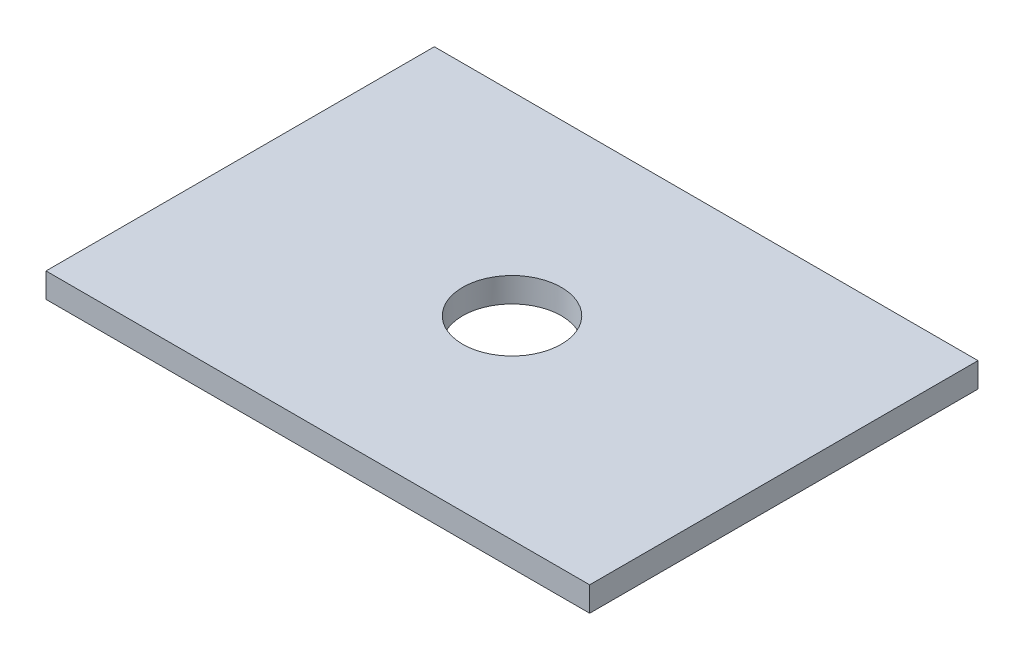
ISO-10303-21;
HEADER;
FILE_DESCRIPTION(('STEP AP214'),'2;1');
FILE_NAME('part.step','',(''),(''),'','','');
FILE_SCHEMA(('AUTOMOTIVE_DESIGN { 1 0 10303 214 1 1 1 1 }'));
ENDSEC;
DATA;
#1=APPLICATION_CONTEXT('core data for automotive mechanical design processes');
#2=APPLICATION_PROTOCOL_DEFINITION('international standard','automotive_design',2000,#1);
#3=PRODUCT_CONTEXT('',#1,'mechanical');
#4=PRODUCT('Part','Part','',(#3));
#5=PRODUCT_RELATED_PRODUCT_CATEGORY('part','',(#4));
#6=PRODUCT_DEFINITION_FORMATION('','',#4);
#7=PRODUCT_DEFINITION_CONTEXT('part definition',#1,'design');
#8=PRODUCT_DEFINITION('design','',#6,#7);
#9=PRODUCT_DEFINITION_SHAPE('','',#8);
#10=(LENGTH_UNIT() NAMED_UNIT(*) SI_UNIT(.MILLI.,.METRE.));
#11=(NAMED_UNIT(*) PLANE_ANGLE_UNIT() SI_UNIT($,.RADIAN.));
#12=(NAMED_UNIT(*) SI_UNIT($,.STERADIAN.) SOLID_ANGLE_UNIT());
#13=UNCERTAINTY_MEASURE_WITH_UNIT(LENGTH_MEASURE(1.E-05),#10,'distance_accuracy_value','');
#14=(GEOMETRIC_REPRESENTATION_CONTEXT(3) GLOBAL_UNCERTAINTY_ASSIGNED_CONTEXT((#13)) GLOBAL_UNIT_ASSIGNED_CONTEXT((#10,
#11,#12)) REPRESENTATION_CONTEXT('',''));
#15=CARTESIAN_POINT('',(0.,0.,0.));
#16=DIRECTION('',(0.,0.,1.));
#17=DIRECTION('',(1.,0.,0.));
#18=AXIS2_PLACEMENT_3D('',#15,#16,#17);
#19=CARTESIAN_POINT('',(0.,6.35,0.));
#20=DIRECTION('',(1.,0.,0.));
#21=DIRECTION('',(0.,0.,-1.));
#22=AXIS2_PLACEMENT_3D('',#19,#20,#21);
#23=PLANE('',#22);
#24=DIRECTION('',(0.,0.,1.));
#25=VECTOR('',#24,1.);
#26=CARTESIAN_POINT('',(0.,0.,0.));
#27=LINE('',#26,#25);
#28=CARTESIAN_POINT('',(0.,0.,-100.));
#29=VERTEX_POINT('',#28);
#30=CARTESIAN_POINT('',(0.,0.,0.));
#31=VERTEX_POINT('',#30);
#32=EDGE_CURVE('E98',#29,#31,#27,.T.);
#33=ORIENTED_EDGE('',*,*,#32,.T.);
#34=DIRECTION('',(0.,-1.,0.));
#35=VECTOR('',#34,1.);
#36=CARTESIAN_POINT('',(0.,6.35,0.));
#37=LINE('',#36,#35);
#38=CARTESIAN_POINT('',(0.,6.35,0.));
#39=VERTEX_POINT('',#38);
#40=EDGE_CURVE('E11',#39,#31,#37,.T.);
#41=ORIENTED_EDGE('',*,*,#40,.F.);
#42=DIRECTION('',(0.,0.,1.));
#43=VECTOR('',#42,1.);
#44=CARTESIAN_POINT('',(0.,6.35,0.));
#45=LINE('',#44,#43);
#46=CARTESIAN_POINT('',(0.,6.35,-100.));
#47=VERTEX_POINT('',#46);
#48=EDGE_CURVE('E85',#47,#39,#45,.T.);
#49=ORIENTED_EDGE('',*,*,#48,.F.);
#50=DIRECTION('',(0.,-1.,0.));
#51=VECTOR('',#50,1.);
#52=CARTESIAN_POINT('',(0.,6.35,-100.));
#53=LINE('',#52,#51);
#54=EDGE_CURVE('E94',#47,#29,#53,.T.);
#55=ORIENTED_EDGE('',*,*,#54,.T.);
#56=EDGE_LOOP('',(#33,#41,#49,#55));
#57=FACE_BOUND('',#56,.T.);
#58=ADVANCED_FACE('F33',(#57),#23,.F.);
#59=CARTESIAN_POINT('',(0.,6.35,0.));
#60=DIRECTION('',(0.,0.,-1.));
#61=DIRECTION('',(-1.,0.,0.));
#62=AXIS2_PLACEMENT_3D('',#59,#60,#61);
#63=PLANE('',#62);
#64=DIRECTION('',(1.,0.,0.));
#65=VECTOR('',#64,1.);
#66=CARTESIAN_POINT('',(0.,0.,0.));
#67=LINE('',#66,#65);
#68=CARTESIAN_POINT('',(140.,0.,0.));
#69=VERTEX_POINT('',#68);
#70=EDGE_CURVE('E89',#31,#69,#67,.T.);
#71=ORIENTED_EDGE('',*,*,#70,.T.);
#72=DIRECTION('',(0.,-1.,0.));
#73=VECTOR('',#72,1.);
#74=CARTESIAN_POINT('',(140.,6.35,0.));
#75=LINE('',#74,#73);
#76=CARTESIAN_POINT('',(140.,6.35,0.));
#77=VERTEX_POINT('',#76);
#78=EDGE_CURVE('E42',#77,#69,#75,.T.);
#79=ORIENTED_EDGE('',*,*,#78,.F.);
#80=DIRECTION('',(1.,0.,0.));
#81=VECTOR('',#80,1.);
#82=CARTESIAN_POINT('',(0.,6.35,0.));
#83=LINE('',#82,#81);
#84=EDGE_CURVE('E80',#39,#77,#83,.T.);
#85=ORIENTED_EDGE('',*,*,#84,.F.);
#86=ORIENTED_EDGE('',*,*,#40,.T.);
#87=EDGE_LOOP('',(#71,#79,#85,#86));
#88=FACE_BOUND('',#87,.T.);
#89=ADVANCED_FACE('F88',(#88),#63,.F.);
#90=CARTESIAN_POINT('',(140.,6.35,0.));
#91=DIRECTION('',(-1.,0.,0.));
#92=DIRECTION('',(0.,0.,1.));
#93=AXIS2_PLACEMENT_3D('',#90,#91,#92);
#94=PLANE('',#93);
#95=DIRECTION('',(0.,0.,-1.));
#96=VECTOR('',#95,1.);
#97=CARTESIAN_POINT('',(140.,0.,0.));
#98=LINE('',#97,#96);
#99=CARTESIAN_POINT('',(140.,0.,-100.));
#100=VERTEX_POINT('',#99);
#101=EDGE_CURVE('E67',#69,#100,#98,.T.);
#102=ORIENTED_EDGE('',*,*,#101,.T.);
#103=DIRECTION('',(0.,-1.,0.));
#104=VECTOR('',#103,1.);
#105=CARTESIAN_POINT('',(140.,6.35,-100.));
#106=LINE('',#105,#104);
#107=CARTESIAN_POINT('',(140.,6.35,-100.));
#108=VERTEX_POINT('',#107);
#109=EDGE_CURVE('E90',#108,#100,#106,.T.);
#110=ORIENTED_EDGE('',*,*,#109,.F.);
#111=DIRECTION('',(0.,0.,-1.));
#112=VECTOR('',#111,1.);
#113=CARTESIAN_POINT('',(140.,6.35,0.));
#114=LINE('',#113,#112);
#115=EDGE_CURVE('E83',#77,#108,#114,.T.);
#116=ORIENTED_EDGE('',*,*,#115,.F.);
#117=ORIENTED_EDGE('',*,*,#78,.T.);
#118=EDGE_LOOP('',(#102,#110,#116,#117));
#119=FACE_BOUND('',#118,.T.);
#120=ADVANCED_FACE('F92',(#119),#94,.F.);
#121=CARTESIAN_POINT('',(0.,6.35,-100.));
#122=DIRECTION('',(0.,0.,1.));
#123=DIRECTION('',(1.,0.,0.));
#124=AXIS2_PLACEMENT_3D('',#121,#122,#123);
#125=PLANE('',#124);
#126=DIRECTION('',(-1.,0.,0.));
#127=VECTOR('',#126,1.);
#128=CARTESIAN_POINT('',(0.,0.,-100.));
#129=LINE('',#128,#127);
#130=EDGE_CURVE('E73',#100,#29,#129,.T.);
#131=ORIENTED_EDGE('',*,*,#130,.T.);
#132=ORIENTED_EDGE('',*,*,#54,.F.);
#133=DIRECTION('',(-1.,0.,0.));
#134=VECTOR('',#133,1.);
#135=CARTESIAN_POINT('',(0.,6.35,-100.));
#136=LINE('',#135,#134);
#137=EDGE_CURVE('E50',#108,#47,#136,.T.);
#138=ORIENTED_EDGE('',*,*,#137,.F.);
#139=ORIENTED_EDGE('',*,*,#109,.T.);
#140=EDGE_LOOP('',(#131,#132,#138,#139));
#141=FACE_BOUND('',#140,.T.);
#142=ADVANCED_FACE('F105',(#141),#125,.F.);
#143=CARTESIAN_POINT('',(0.,6.35,0.));
#144=DIRECTION('',(0.,-1.,0.));
#145=DIRECTION('',(0.,0.,-1.));
#146=AXIS2_PLACEMENT_3D('',#143,#144,#145);
#147=PLANE('',#146);
#148=CARTESIAN_POINT('',(70.,6.35,-50.));
#149=DIRECTION('',(0.,1.,0.));
#150=DIRECTION('',(0.,0.,1.));
#151=AXIS2_PLACEMENT_3D('',#148,#149,#150);
#152=CIRCLE('',#151,12.705);
#153=CARTESIAN_POINT('',(70.,6.35,-37.295));
#154=VERTEX_POINT('',#153);
#155=EDGE_CURVE('E111',#154,#154,#152,.T.);
#156=ORIENTED_EDGE('',*,*,#155,.F.);
#157=EDGE_LOOP('',(#156));
#158=FACE_BOUND('',#157,.T.);
#159=ORIENTED_EDGE('',*,*,#48,.T.);
#160=ORIENTED_EDGE('',*,*,#84,.T.);
#161=ORIENTED_EDGE('',*,*,#115,.T.);
#162=ORIENTED_EDGE('',*,*,#137,.T.);
#163=EDGE_LOOP('',(#159,#160,#161,#162));
#164=FACE_BOUND('',#163,.T.);
#165=ADVANCED_FACE('F81',(#158,#164),#147,.F.);
#166=CARTESIAN_POINT('',(0.,0.,0.));
#167=DIRECTION('',(0.,-1.,0.));
#168=DIRECTION('',(0.,0.,-1.));
#169=AXIS2_PLACEMENT_3D('',#166,#167,#168);
#170=PLANE('',#169);
#171=CARTESIAN_POINT('',(70.,0.,-50.));
#172=DIRECTION('',(0.,-1.,0.));
#173=DIRECTION('',(0.,0.,-1.));
#174=AXIS2_PLACEMENT_3D('',#171,#172,#173);
#175=CIRCLE('',#174,12.705);
#176=CARTESIAN_POINT('',(70.,0.,-62.705));
#177=VERTEX_POINT('',#176);
#178=EDGE_CURVE('E36',#177,#177,#175,.T.);
#179=ORIENTED_EDGE('',*,*,#178,.F.);
#180=EDGE_LOOP('',(#179));
#181=FACE_BOUND('',#180,.T.);
#182=ORIENTED_EDGE('',*,*,#32,.F.);
#183=ORIENTED_EDGE('',*,*,#130,.F.);
#184=ORIENTED_EDGE('',*,*,#101,.F.);
#185=ORIENTED_EDGE('',*,*,#70,.F.);
#186=EDGE_LOOP('',(#182,#183,#184,#185));
#187=FACE_BOUND('',#186,.T.);
#188=ADVANCED_FACE('F108',(#181,#187),#170,.T.);
#189=CARTESIAN_POINT('',(70.,-3.65,-50.));
#190=DIRECTION('',(0.,1.,0.));
#191=DIRECTION('',(0.,0.,1.));
#192=AXIS2_PLACEMENT_3D('',#189,#190,#191);
#193=CYLINDRICAL_SURFACE('',#192,12.705);
#194=ORIENTED_EDGE('',*,*,#178,.T.);
#195=EDGE_LOOP('',(#194));
#196=FACE_BOUND('',#195,.T.);
#197=ORIENTED_EDGE('',*,*,#155,.T.);
#198=EDGE_LOOP('',(#197));
#199=FACE_BOUND('',#198,.T.);
#200=ADVANCED_FACE('F118',(#196,#199),#193,.F.);
#201=CLOSED_SHELL('',(#58,#89,#120,#142,#165,#188,#200));
#202=MANIFOLD_SOLID_BREP('B2',#201);
#203=ADVANCED_BREP_SHAPE_REPRESENTATION('',(#18,#202),#14);
#204=SHAPE_DEFINITION_REPRESENTATION(#9,#203);
ENDSEC;
END-ISO-10303-21;
